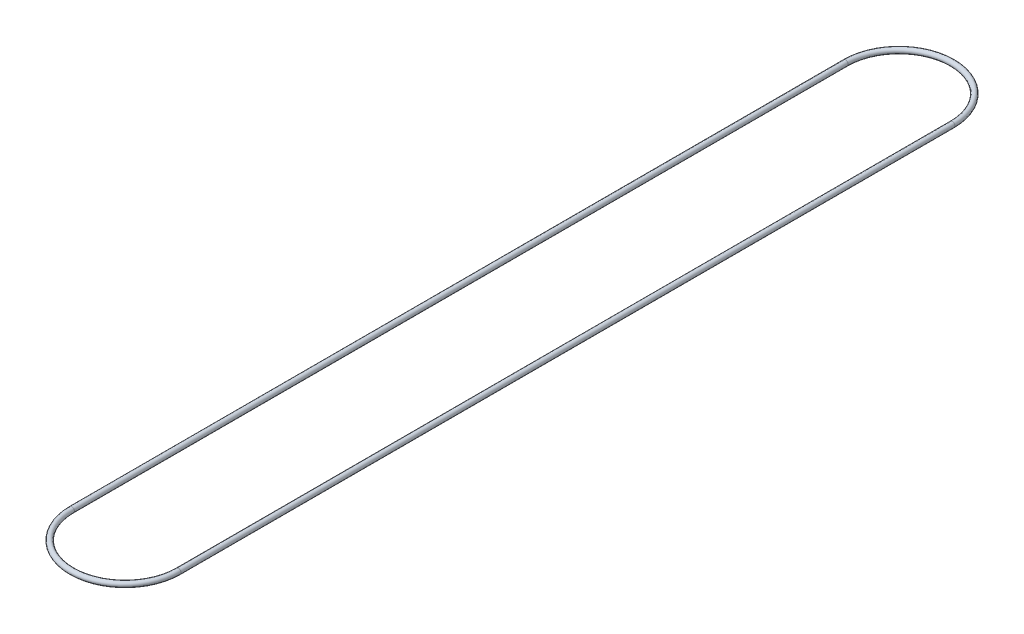
ISO-10303-21;
HEADER;
FILE_DESCRIPTION(('STEP AP214'),'2;1');
FILE_NAME('part.step','',(''),(''),'','','');
FILE_SCHEMA(('AUTOMOTIVE_DESIGN { 1 0 10303 214 1 1 1 1 }'));
ENDSEC;
DATA;
#1=APPLICATION_CONTEXT('core data for automotive mechanical design processes');
#2=APPLICATION_PROTOCOL_DEFINITION('international standard','automotive_design',2000,#1);
#3=PRODUCT_CONTEXT('',#1,'mechanical');
#4=PRODUCT('Part','Part','',(#3));
#5=PRODUCT_RELATED_PRODUCT_CATEGORY('part','',(#4));
#6=PRODUCT_DEFINITION_FORMATION('','',#4);
#7=PRODUCT_DEFINITION_CONTEXT('part definition',#1,'design');
#8=PRODUCT_DEFINITION('design','',#6,#7);
#9=PRODUCT_DEFINITION_SHAPE('','',#8);
#10=(LENGTH_UNIT() NAMED_UNIT(*) SI_UNIT(.MILLI.,.METRE.));
#11=(NAMED_UNIT(*) PLANE_ANGLE_UNIT() SI_UNIT($,.RADIAN.));
#12=(NAMED_UNIT(*) SI_UNIT($,.STERADIAN.) SOLID_ANGLE_UNIT());
#13=UNCERTAINTY_MEASURE_WITH_UNIT(LENGTH_MEASURE(1.E-05),#10,'distance_accuracy_value','');
#14=(GEOMETRIC_REPRESENTATION_CONTEXT(3) GLOBAL_UNCERTAINTY_ASSIGNED_CONTEXT((#13)) GLOBAL_UNIT_ASSIGNED_CONTEXT((#10,
#11,#12)) REPRESENTATION_CONTEXT('',''));
#15=CARTESIAN_POINT('',(0.,0.,0.));
#16=DIRECTION('',(0.,0.,1.));
#17=DIRECTION('',(1.,0.,0.));
#18=AXIS2_PLACEMENT_3D('',#15,#16,#17);
#19=CARTESIAN_POINT('',(0.,0.,0.));
#20=DIRECTION('',(0.,-1.,0.));
#21=DIRECTION('',(0.,0.,-1.));
#22=AXIS2_PLACEMENT_3D('',#19,#20,#21);
#23=TOROIDAL_SURFACE('',#22,5.00000000000001,0.25);
#24=CARTESIAN_POINT('',(-5.00000000000001,0.,0.));
#25=DIRECTION('',(0.,0.,1.));
#26=DIRECTION('',(1.,0.,0.));
#27=AXIS2_PLACEMENT_3D('',#24,#25,#26);
#28=CIRCLE('',#27,0.25);
#29=CARTESIAN_POINT('',(-5.25000000000001,0.,0.));
#30=VERTEX_POINT('',#29);
#31=EDGE_CURVE('E45',#30,#30,#28,.T.);
#32=CARTESIAN_POINT('',(5.00000000000001,0.,0.));
#33=DIRECTION('',(0.,0.,-1.));
#34=DIRECTION('',(-1.,0.,0.));
#35=AXIS2_PLACEMENT_3D('',#32,#33,#34);
#36=CIRCLE('',#35,0.25);
#37=CARTESIAN_POINT('',(5.25000000000001,0.,0.));
#38=VERTEX_POINT('',#37);
#39=EDGE_CURVE('E41',#38,#38,#36,.T.);
#40=CARTESIAN_POINT('',(0.,0.,0.));
#41=DIRECTION('',(0.,-1.,0.));
#42=DIRECTION('',(0.,0.,-1.));
#43=AXIS2_PLACEMENT_3D('',#40,#41,#42);
#44=CIRCLE('',#43,5.25000000000001);
#45=EDGE_CURVE('',#30,#38,#44,.T.);
#46=ORIENTED_EDGE('',*,*,#31,.F.);
#47=ORIENTED_EDGE('',*,*,#39,.T.);
#48=ORIENTED_EDGE('',*,*,#45,.T.);
#49=ORIENTED_EDGE('',*,*,#45,.F.);
#50=EDGE_LOOP('',(#46,#48,#47,#49));
#51=FACE_BOUND('',#50,.T.);
#52=ADVANCED_FACE('F30',(#51),#23,.T.);
#53=CARTESIAN_POINT('',(5.00000000000001,0.,0.));
#54=DIRECTION('',(0.,0.,1.));
#55=DIRECTION('',(1.,0.,0.));
#56=AXIS2_PLACEMENT_3D('',#53,#54,#55);
#57=CYLINDRICAL_SURFACE('',#56,0.25);
#58=CARTESIAN_POINT('',(5.,0.,72.509034));
#59=DIRECTION('',(0.,0.,-1.));
#60=DIRECTION('',(-1.,0.,0.));
#61=AXIS2_PLACEMENT_3D('',#58,#59,#60);
#62=CIRCLE('',#61,0.25);
#63=CARTESIAN_POINT('',(5.25,0.,72.509034));
#64=VERTEX_POINT('',#63);
#65=EDGE_CURVE('E37',#64,#64,#62,.T.);
#66=ORIENTED_EDGE('',*,*,#65,.T.);
#67=EDGE_LOOP('',(#66));
#68=FACE_BOUND('',#67,.T.);
#69=ORIENTED_EDGE('',*,*,#39,.F.);
#70=EDGE_LOOP('',(#69));
#71=FACE_BOUND('',#70,.T.);
#72=ADVANCED_FACE('F54',(#68,#71),#57,.T.);
#73=CARTESIAN_POINT('',(0.,0.,72.509034));
#74=DIRECTION('',(0.,-1.,0.));
#75=DIRECTION('',(0.,0.,-1.));
#76=AXIS2_PLACEMENT_3D('',#73,#74,#75);
#77=TOROIDAL_SURFACE('',#76,5.,0.25);
#78=CARTESIAN_POINT('',(-5.,0.,72.509034));
#79=DIRECTION('',(0.,0.,1.));
#80=DIRECTION('',(1.,0.,0.));
#81=AXIS2_PLACEMENT_3D('',#78,#79,#80);
#82=CIRCLE('',#81,0.25);
#83=CARTESIAN_POINT('',(-5.25,0.,72.509034));
#84=VERTEX_POINT('',#83);
#85=EDGE_CURVE('E10',#84,#84,#82,.T.);
#86=CARTESIAN_POINT('',(0.,0.,72.509034));
#87=DIRECTION('',(0.,-1.,0.));
#88=DIRECTION('',(0.,0.,-1.));
#89=AXIS2_PLACEMENT_3D('',#86,#87,#88);
#90=CIRCLE('',#89,5.25);
#91=EDGE_CURVE('',#64,#84,#90,.T.);
#92=ORIENTED_EDGE('',*,*,#65,.F.);
#93=ORIENTED_EDGE('',*,*,#85,.T.);
#94=ORIENTED_EDGE('',*,*,#91,.T.);
#95=ORIENTED_EDGE('',*,*,#91,.F.);
#96=EDGE_LOOP('',(#92,#94,#93,#95));
#97=FACE_BOUND('',#96,.T.);
#98=ADVANCED_FACE('F60',(#97),#77,.T.);
#99=CARTESIAN_POINT('',(-5.,0.,72.509034));
#100=DIRECTION('',(0.,0.,-1.));
#101=DIRECTION('',(-1.,0.,0.));
#102=AXIS2_PLACEMENT_3D('',#99,#100,#101);
#103=CYLINDRICAL_SURFACE('',#102,0.25);
#104=ORIENTED_EDGE('',*,*,#31,.T.);
#105=EDGE_LOOP('',(#104));
#106=FACE_BOUND('',#105,.T.);
#107=ORIENTED_EDGE('',*,*,#85,.F.);
#108=EDGE_LOOP('',(#107));
#109=FACE_BOUND('',#108,.T.);
#110=ADVANCED_FACE('F32',(#106,#109),#103,.T.);
#111=CLOSED_SHELL('',(#52,#72,#98,#110));
#112=MANIFOLD_SOLID_BREP('B2',#111);
#113=ADVANCED_BREP_SHAPE_REPRESENTATION('',(#18,#112),#14);
#114=SHAPE_DEFINITION_REPRESENTATION(#9,#113);
ENDSEC;
END-ISO-10303-21;
